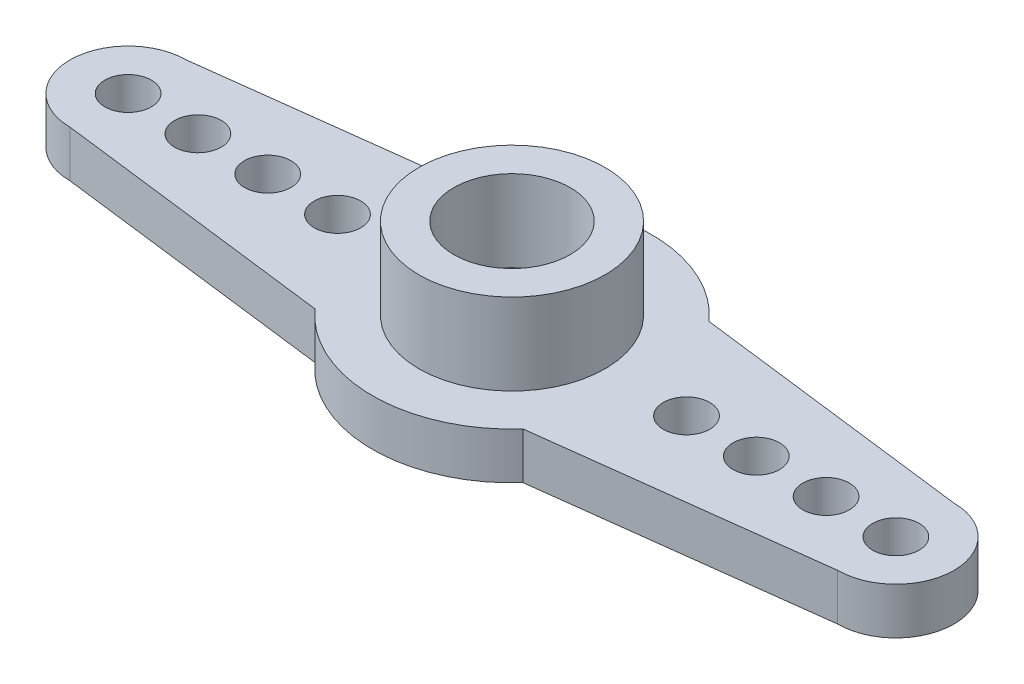
ISO-10303-21;
HEADER;
FILE_DESCRIPTION(('STEP AP214'),'2;1');
FILE_NAME('part.step','',(''),(''),'','','');
FILE_SCHEMA(('AUTOMOTIVE_DESIGN { 1 0 10303 214 1 1 1 1 }'));
ENDSEC;
DATA;
#1=APPLICATION_CONTEXT('core data for automotive mechanical design processes');
#2=APPLICATION_PROTOCOL_DEFINITION('international standard','automotive_design',2000,#1);
#3=PRODUCT_CONTEXT('',#1,'mechanical');
#4=PRODUCT('Part','Part','',(#3));
#5=PRODUCT_RELATED_PRODUCT_CATEGORY('part','',(#4));
#6=PRODUCT_DEFINITION_FORMATION('','',#4);
#7=PRODUCT_DEFINITION_CONTEXT('part definition',#1,'design');
#8=PRODUCT_DEFINITION('design','',#6,#7);
#9=PRODUCT_DEFINITION_SHAPE('','',#8);
#10=(LENGTH_UNIT() NAMED_UNIT(*) SI_UNIT(.MILLI.,.METRE.));
#11=(NAMED_UNIT(*) PLANE_ANGLE_UNIT() SI_UNIT($,.RADIAN.));
#12=(NAMED_UNIT(*) SI_UNIT($,.STERADIAN.) SOLID_ANGLE_UNIT());
#13=UNCERTAINTY_MEASURE_WITH_UNIT(LENGTH_MEASURE(1.E-05),#10,'distance_accuracy_value','');
#14=(GEOMETRIC_REPRESENTATION_CONTEXT(3) GLOBAL_UNCERTAINTY_ASSIGNED_CONTEXT((#13)) GLOBAL_UNIT_ASSIGNED_CONTEXT((#10,
#11,#12)) REPRESENTATION_CONTEXT('',''));
#15=CARTESIAN_POINT('',(0.,0.,0.));
#16=DIRECTION('',(0.,0.,1.));
#17=DIRECTION('',(1.,0.,0.));
#18=AXIS2_PLACEMENT_3D('',#15,#16,#17);
#19=CARTESIAN_POINT('',(16.5,2.,0.));
#20=DIRECTION('',(0.,1.,0.));
#21=DIRECTION('',(0.,0.,1.));
#22=AXIS2_PLACEMENT_3D('',#19,#20,#21);
#23=PLANE('',#22);
#24=CARTESIAN_POINT('',(-16.5,2.,0.));
#25=DIRECTION('',(0.,1.,0.));
#26=DIRECTION('',(0.,0.,1.));
#27=AXIS2_PLACEMENT_3D('',#24,#25,#26);
#28=CIRCLE('',#27,1.);
#29=CARTESIAN_POINT('',(-16.5,2.,0.999999999999996));
#30=VERTEX_POINT('',#29);
#31=EDGE_CURVE('E202',#30,#30,#28,.F.);
#32=ORIENTED_EDGE('',*,*,#31,.T.);
#33=EDGE_LOOP('',(#32));
#34=FACE_BOUND('',#33,.T.);
#35=CARTESIAN_POINT('',(-13.5,2.,0.));
#36=DIRECTION('',(0.,1.,0.));
#37=DIRECTION('',(0.,0.,1.));
#38=AXIS2_PLACEMENT_3D('',#35,#36,#37);
#39=CIRCLE('',#38,1.);
#40=CARTESIAN_POINT('',(-13.5,2.,0.999999999999976));
#41=VERTEX_POINT('',#40);
#42=EDGE_CURVE('E207',#41,#41,#39,.F.);
#43=ORIENTED_EDGE('',*,*,#42,.T.);
#44=EDGE_LOOP('',(#43));
#45=FACE_BOUND('',#44,.T.);
#46=CARTESIAN_POINT('',(-7.5,2.,0.));
#47=DIRECTION('',(0.,1.,0.));
#48=DIRECTION('',(0.,0.,1.));
#49=AXIS2_PLACEMENT_3D('',#46,#47,#48);
#50=CIRCLE('',#49,1.);
#51=CARTESIAN_POINT('',(-7.5,2.,0.999999999999936));
#52=VERTEX_POINT('',#51);
#53=EDGE_CURVE('E222',#52,#52,#50,.F.);
#54=ORIENTED_EDGE('',*,*,#53,.T.);
#55=EDGE_LOOP('',(#54));
#56=FACE_BOUND('',#55,.T.);
#57=CARTESIAN_POINT('',(-10.5,2.,0.));
#58=DIRECTION('',(0.,1.,0.));
#59=DIRECTION('',(0.,0.,1.));
#60=AXIS2_PLACEMENT_3D('',#57,#58,#59);
#61=CIRCLE('',#60,1.);
#62=CARTESIAN_POINT('',(-10.5,2.,0.999999999999956));
#63=VERTEX_POINT('',#62);
#64=EDGE_CURVE('E225',#63,#63,#61,.F.);
#65=ORIENTED_EDGE('',*,*,#64,.T.);
#66=EDGE_LOOP('',(#65));
#67=FACE_BOUND('',#66,.T.);
#68=CARTESIAN_POINT('',(0.,2.,0.));
#69=DIRECTION('',(0.,1.,0.));
#70=DIRECTION('',(0.,0.,1.));
#71=AXIS2_PLACEMENT_3D('',#68,#69,#70);
#72=CIRCLE('',#71,4.);
#73=CARTESIAN_POINT('',(0.,2.,4.));
#74=VERTEX_POINT('',#73);
#75=EDGE_CURVE('E187',#74,#74,#72,.T.);
#76=ORIENTED_EDGE('',*,*,#75,.F.);
#77=EDGE_LOOP('',(#76));
#78=FACE_BOUND('',#77,.T.);
#79=CARTESIAN_POINT('',(16.5,2.,0.));
#80=DIRECTION('',(0.,1.,0.));
#81=DIRECTION('',(0.,0.,1.));
#82=AXIS2_PLACEMENT_3D('',#79,#80,#81);
#83=CIRCLE('',#82,2.5);
#84=CARTESIAN_POINT('',(16.5,2.,2.5));
#85=VERTEX_POINT('',#84);
#86=CARTESIAN_POINT('',(16.5,2.,-2.5));
#87=VERTEX_POINT('',#86);
#88=EDGE_CURVE('E148',#85,#87,#83,.T.);
#89=ORIENTED_EDGE('',*,*,#88,.T.);
#90=DIRECTION('',(-0.992313202794284,0.,-0.123751798209769));
#91=VECTOR('',#90,1.);
#92=CARTESIAN_POINT('',(16.5,2.,-2.5));
#93=LINE('',#92,#91);
#94=CARTESIAN_POINT('',(4.47213595499958,2.,-4.));
#95=VERTEX_POINT('',#94);
#96=EDGE_CURVE('E96',#87,#95,#93,.T.);
#97=ORIENTED_EDGE('',*,*,#96,.T.);
#98=CARTESIAN_POINT('',(0.,2.,0.));
#99=DIRECTION('',(0.,1.,0.));
#100=DIRECTION('',(0.,0.,1.));
#101=AXIS2_PLACEMENT_3D('',#98,#99,#100);
#102=CIRCLE('',#101,6.);
#103=CARTESIAN_POINT('',(-4.47213595499958,2.,-4.));
#104=VERTEX_POINT('',#103);
#105=EDGE_CURVE('E181',#95,#104,#102,.T.);
#106=ORIENTED_EDGE('',*,*,#105,.T.);
#107=DIRECTION('',(-0.992313202794284,0.,0.123751798209769));
#108=VECTOR('',#107,1.);
#109=CARTESIAN_POINT('',(-16.5,2.,-2.5));
#110=LINE('',#109,#108);
#111=CARTESIAN_POINT('',(-16.5,2.,-2.5));
#112=VERTEX_POINT('',#111);
#113=EDGE_CURVE('E180',#104,#112,#110,.T.);
#114=ORIENTED_EDGE('',*,*,#113,.T.);
#115=CARTESIAN_POINT('',(-16.5,2.,0.));
#116=DIRECTION('',(0.,1.,0.));
#117=DIRECTION('',(0.,0.,1.));
#118=AXIS2_PLACEMENT_3D('',#115,#116,#117);
#119=CIRCLE('',#118,2.5);
#120=CARTESIAN_POINT('',(-16.5,2.,2.5));
#121=VERTEX_POINT('',#120);
#122=EDGE_CURVE('E115',#112,#121,#119,.T.);
#123=ORIENTED_EDGE('',*,*,#122,.T.);
#124=DIRECTION('',(0.992313202794284,0.,0.123751798209769));
#125=VECTOR('',#124,1.);
#126=CARTESIAN_POINT('',(-16.5,2.,2.5));
#127=LINE('',#126,#125);
#128=CARTESIAN_POINT('',(-4.47213595499958,2.,4.));
#129=VERTEX_POINT('',#128);
#130=EDGE_CURVE('E109',#121,#129,#127,.T.);
#131=ORIENTED_EDGE('',*,*,#130,.T.);
#132=CARTESIAN_POINT('',(0.,2.,0.));
#133=DIRECTION('',(0.,1.,0.));
#134=DIRECTION('',(0.,0.,1.));
#135=AXIS2_PLACEMENT_3D('',#132,#133,#134);
#136=CIRCLE('',#135,6.);
#137=CARTESIAN_POINT('',(4.47213595499958,2.,4.));
#138=VERTEX_POINT('',#137);
#139=EDGE_CURVE('E113',#129,#138,#136,.T.);
#140=ORIENTED_EDGE('',*,*,#139,.T.);
#141=DIRECTION('',(0.992313202794284,0.,-0.123751798209769));
#142=VECTOR('',#141,1.);
#143=CARTESIAN_POINT('',(16.5,2.,2.5));
#144=LINE('',#143,#142);
#145=EDGE_CURVE('E52',#138,#85,#144,.T.);
#146=ORIENTED_EDGE('',*,*,#145,.T.);
#147=EDGE_LOOP('',(#89,#97,#106,#114,#123,#131,#140,#146));
#148=FACE_BOUND('',#147,.T.);
#149=CARTESIAN_POINT('',(7.5,2.,0.));
#150=DIRECTION('',(0.,1.,0.));
#151=DIRECTION('',(0.,0.,1.));
#152=AXIS2_PLACEMENT_3D('',#149,#150,#151);
#153=CIRCLE('',#152,1.);
#154=CARTESIAN_POINT('',(7.5,2.,0.999999999999939));
#155=VERTEX_POINT('',#154);
#156=EDGE_CURVE('E219',#155,#155,#153,.T.);
#157=ORIENTED_EDGE('',*,*,#156,.F.);
#158=EDGE_LOOP('',(#157));
#159=FACE_BOUND('',#158,.T.);
#160=CARTESIAN_POINT('',(10.5,2.,0.));
#161=DIRECTION('',(0.,1.,0.));
#162=DIRECTION('',(0.,0.,1.));
#163=AXIS2_PLACEMENT_3D('',#160,#161,#162);
#164=CIRCLE('',#163,1.);
#165=CARTESIAN_POINT('',(10.5,2.,0.99999999999996));
#166=VERTEX_POINT('',#165);
#167=EDGE_CURVE('E216',#166,#166,#164,.T.);
#168=ORIENTED_EDGE('',*,*,#167,.F.);
#169=EDGE_LOOP('',(#168));
#170=FACE_BOUND('',#169,.T.);
#171=CARTESIAN_POINT('',(13.5,2.,0.));
#172=DIRECTION('',(0.,1.,0.));
#173=DIRECTION('',(0.,0.,1.));
#174=AXIS2_PLACEMENT_3D('',#171,#172,#173);
#175=CIRCLE('',#174,1.);
#176=CARTESIAN_POINT('',(13.5,2.,0.99999999999998));
#177=VERTEX_POINT('',#176);
#178=EDGE_CURVE('E213',#177,#177,#175,.T.);
#179=ORIENTED_EDGE('',*,*,#178,.F.);
#180=EDGE_LOOP('',(#179));
#181=FACE_BOUND('',#180,.T.);
#182=CARTESIAN_POINT('',(16.5,2.,0.));
#183=DIRECTION('',(0.,1.,0.));
#184=DIRECTION('',(0.,0.,1.));
#185=AXIS2_PLACEMENT_3D('',#182,#183,#184);
#186=CIRCLE('',#185,1.);
#187=CARTESIAN_POINT('',(16.5,2.,1.));
#188=VERTEX_POINT('',#187);
#189=EDGE_CURVE('E210',#188,#188,#186,.T.);
#190=ORIENTED_EDGE('',*,*,#189,.F.);
#191=EDGE_LOOP('',(#190));
#192=FACE_BOUND('',#191,.T.);
#193=ADVANCED_FACE('F34',(#34,#45,#56,#67,#78,#148,#159,#170,#181,#192),#23,.T.);
#194=CARTESIAN_POINT('',(16.5,0.,0.));
#195=DIRECTION('',(0.,1.,0.));
#196=DIRECTION('',(0.,0.,1.));
#197=AXIS2_PLACEMENT_3D('',#194,#195,#196);
#198=PLANE('',#197);
#199=CARTESIAN_POINT('',(-16.5,0.,0.));
#200=DIRECTION('',(0.,-1.,0.));
#201=DIRECTION('',(0.,0.,-1.));
#202=AXIS2_PLACEMENT_3D('',#199,#200,#201);
#203=CIRCLE('',#202,1.);
#204=CARTESIAN_POINT('',(-16.5,0.,-1.00000000000001));
#205=VERTEX_POINT('',#204);
#206=EDGE_CURVE('E228',#205,#205,#203,.F.);
#207=ORIENTED_EDGE('',*,*,#206,.T.);
#208=EDGE_LOOP('',(#207));
#209=FACE_BOUND('',#208,.T.);
#210=CARTESIAN_POINT('',(-13.5,0.,0.));
#211=DIRECTION('',(0.,1.,0.));
#212=DIRECTION('',(0.,0.,1.));
#213=AXIS2_PLACEMENT_3D('',#210,#211,#212);
#214=CIRCLE('',#213,1.);
#215=CARTESIAN_POINT('',(-13.5,0.,0.999999999999976));
#216=VERTEX_POINT('',#215);
#217=EDGE_CURVE('E242',#216,#216,#214,.T.);
#218=ORIENTED_EDGE('',*,*,#217,.T.);
#219=EDGE_LOOP('',(#218));
#220=FACE_BOUND('',#219,.T.);
#221=CARTESIAN_POINT('',(13.5,0.,0.));
#222=DIRECTION('',(0.,-1.,0.));
#223=DIRECTION('',(0.,0.,-1.));
#224=AXIS2_PLACEMENT_3D('',#221,#222,#223);
#225=CIRCLE('',#224,1.);
#226=CARTESIAN_POINT('',(13.5,0.,-1.00000000000002));
#227=VERTEX_POINT('',#226);
#228=EDGE_CURVE('E233',#227,#227,#225,.T.);
#229=ORIENTED_EDGE('',*,*,#228,.F.);
#230=EDGE_LOOP('',(#229));
#231=FACE_BOUND('',#230,.T.);
#232=CARTESIAN_POINT('',(7.5,0.,0.));
#233=DIRECTION('',(0.,-1.,0.));
#234=DIRECTION('',(0.,0.,-1.));
#235=AXIS2_PLACEMENT_3D('',#232,#233,#234);
#236=CIRCLE('',#235,1.);
#237=CARTESIAN_POINT('',(7.5,0.,-1.00000000000006));
#238=VERTEX_POINT('',#237);
#239=EDGE_CURVE('E232',#238,#238,#236,.T.);
#240=ORIENTED_EDGE('',*,*,#239,.F.);
#241=EDGE_LOOP('',(#240));
#242=FACE_BOUND('',#241,.T.);
#243=CARTESIAN_POINT('',(-7.5,0.,0.));
#244=DIRECTION('',(0.,-1.,0.));
#245=DIRECTION('',(0.,0.,-1.));
#246=AXIS2_PLACEMENT_3D('',#243,#244,#245);
#247=CIRCLE('',#246,1.);
#248=CARTESIAN_POINT('',(-7.5,0.,-1.00000000000007));
#249=VERTEX_POINT('',#248);
#250=EDGE_CURVE('E236',#249,#249,#247,.F.);
#251=ORIENTED_EDGE('',*,*,#250,.T.);
#252=EDGE_LOOP('',(#251));
#253=FACE_BOUND('',#252,.T.);
#254=CARTESIAN_POINT('',(-10.5,0.,0.));
#255=DIRECTION('',(0.,-1.,0.));
#256=DIRECTION('',(0.,0.,-1.));
#257=AXIS2_PLACEMENT_3D('',#254,#255,#256);
#258=CIRCLE('',#257,1.);
#259=CARTESIAN_POINT('',(-10.5,0.,-1.00000000000005));
#260=VERTEX_POINT('',#259);
#261=EDGE_CURVE('E239',#260,#260,#258,.F.);
#262=ORIENTED_EDGE('',*,*,#261,.T.);
#263=EDGE_LOOP('',(#262));
#264=FACE_BOUND('',#263,.T.);
#265=CARTESIAN_POINT('',(0.,0.,0.));
#266=DIRECTION('',(0.,-1.,0.));
#267=DIRECTION('',(0.,0.,-1.));
#268=AXIS2_PLACEMENT_3D('',#265,#266,#267);
#269=CIRCLE('',#268,3.);
#270=CARTESIAN_POINT('',(0.,0.,-3.));
#271=VERTEX_POINT('',#270);
#272=EDGE_CURVE('E198',#271,#271,#269,.T.);
#273=ORIENTED_EDGE('',*,*,#272,.F.);
#274=EDGE_LOOP('',(#273));
#275=FACE_BOUND('',#274,.T.);
#276=CARTESIAN_POINT('',(16.5,0.,0.));
#277=DIRECTION('',(0.,1.,0.));
#278=DIRECTION('',(0.,0.,1.));
#279=AXIS2_PLACEMENT_3D('',#276,#277,#278);
#280=CIRCLE('',#279,2.5);
#281=CARTESIAN_POINT('',(16.5,0.,2.5));
#282=VERTEX_POINT('',#281);
#283=CARTESIAN_POINT('',(16.5,0.,-2.5));
#284=VERTEX_POINT('',#283);
#285=EDGE_CURVE('E133',#282,#284,#280,.T.);
#286=ORIENTED_EDGE('',*,*,#285,.F.);
#287=DIRECTION('',(0.992313202794284,0.,-0.123751798209769));
#288=VECTOR('',#287,1.);
#289=CARTESIAN_POINT('',(16.5,0.,2.5));
#290=LINE('',#289,#288);
#291=CARTESIAN_POINT('',(4.47213595499958,0.,4.));
#292=VERTEX_POINT('',#291);
#293=EDGE_CURVE('E87',#292,#282,#290,.T.);
#294=ORIENTED_EDGE('',*,*,#293,.F.);
#295=CARTESIAN_POINT('',(0.,0.,0.));
#296=DIRECTION('',(0.,1.,0.));
#297=DIRECTION('',(0.,0.,1.));
#298=AXIS2_PLACEMENT_3D('',#295,#296,#297);
#299=CIRCLE('',#298,6.);
#300=CARTESIAN_POINT('',(-4.47213595499958,0.,4.));
#301=VERTEX_POINT('',#300);
#302=EDGE_CURVE('E81',#301,#292,#299,.T.);
#303=ORIENTED_EDGE('',*,*,#302,.F.);
#304=DIRECTION('',(0.992313202794284,0.,0.123751798209769));
#305=VECTOR('',#304,1.);
#306=CARTESIAN_POINT('',(-16.5,0.,2.5));
#307=LINE('',#306,#305);
#308=CARTESIAN_POINT('',(-16.5,0.,2.5));
#309=VERTEX_POINT('',#308);
#310=EDGE_CURVE('E123',#309,#301,#307,.T.);
#311=ORIENTED_EDGE('',*,*,#310,.F.);
#312=CARTESIAN_POINT('',(-16.5,0.,0.));
#313=DIRECTION('',(0.,1.,0.));
#314=DIRECTION('',(0.,0.,1.));
#315=AXIS2_PLACEMENT_3D('',#312,#313,#314);
#316=CIRCLE('',#315,2.5);
#317=CARTESIAN_POINT('',(-16.5,0.,-2.5));
#318=VERTEX_POINT('',#317);
#319=EDGE_CURVE('E143',#318,#309,#316,.T.);
#320=ORIENTED_EDGE('',*,*,#319,.F.);
#321=DIRECTION('',(-0.992313202794284,0.,0.123751798209769));
#322=VECTOR('',#321,1.);
#323=CARTESIAN_POINT('',(-16.5,0.,-2.5));
#324=LINE('',#323,#322);
#325=CARTESIAN_POINT('',(-4.47213595499958,0.,-4.));
#326=VERTEX_POINT('',#325);
#327=EDGE_CURVE('E141',#326,#318,#324,.T.);
#328=ORIENTED_EDGE('',*,*,#327,.F.);
#329=CARTESIAN_POINT('',(0.,0.,0.));
#330=DIRECTION('',(0.,1.,0.));
#331=DIRECTION('',(0.,0.,1.));
#332=AXIS2_PLACEMENT_3D('',#329,#330,#331);
#333=CIRCLE('',#332,6.);
#334=CARTESIAN_POINT('',(4.47213595499958,0.,-4.));
#335=VERTEX_POINT('',#334);
#336=EDGE_CURVE('E139',#335,#326,#333,.T.);
#337=ORIENTED_EDGE('',*,*,#336,.F.);
#338=DIRECTION('',(-0.992313202794284,0.,-0.123751798209769));
#339=VECTOR('',#338,1.);
#340=CARTESIAN_POINT('',(16.5,0.,-2.5));
#341=LINE('',#340,#339);
#342=EDGE_CURVE('E136',#284,#335,#341,.T.);
#343=ORIENTED_EDGE('',*,*,#342,.F.);
#344=EDGE_LOOP('',(#286,#294,#303,#311,#320,#328,#337,#343));
#345=FACE_BOUND('',#344,.T.);
#346=CARTESIAN_POINT('',(10.5,0.,0.));
#347=DIRECTION('',(0.,-1.,0.));
#348=DIRECTION('',(0.,0.,-1.));
#349=AXIS2_PLACEMENT_3D('',#346,#347,#348);
#350=CIRCLE('',#349,1.);
#351=CARTESIAN_POINT('',(10.5,0.,-1.00000000000004));
#352=VERTEX_POINT('',#351);
#353=EDGE_CURVE('E229',#352,#352,#350,.T.);
#354=ORIENTED_EDGE('',*,*,#353,.F.);
#355=EDGE_LOOP('',(#354));
#356=FACE_BOUND('',#355,.T.);
#357=CARTESIAN_POINT('',(16.5,0.,0.));
#358=DIRECTION('',(0.,-1.,0.));
#359=DIRECTION('',(0.,0.,-1.));
#360=AXIS2_PLACEMENT_3D('',#357,#358,#359);
#361=CIRCLE('',#360,1.);
#362=CARTESIAN_POINT('',(16.5,0.,-1.));
#363=VERTEX_POINT('',#362);
#364=EDGE_CURVE('E245',#363,#363,#361,.T.);
#365=ORIENTED_EDGE('',*,*,#364,.F.);
#366=EDGE_LOOP('',(#365));
#367=FACE_BOUND('',#366,.T.);
#368=ADVANCED_FACE('F167',(#209,#220,#231,#242,#253,#264,#275,#345,#356,#367),#198,.F.);
#369=CARTESIAN_POINT('',(0.,-3.,0.));
#370=DIRECTION('',(0.,1.,0.));
#371=DIRECTION('',(0.,0.,1.));
#372=AXIS2_PLACEMENT_3D('',#369,#370,#371);
#373=CYLINDRICAL_SURFACE('',#372,1.5);
#374=CARTESIAN_POINT('',(0.,2.,0.));
#375=DIRECTION('',(0.,1.,0.));
#376=DIRECTION('',(0.,0.,1.));
#377=AXIS2_PLACEMENT_3D('',#374,#375,#376);
#378=CIRCLE('',#377,1.5);
#379=CARTESIAN_POINT('',(0.,2.,1.5));
#380=VERTEX_POINT('',#379);
#381=EDGE_CURVE('E195',#380,#380,#378,.T.);
#382=ORIENTED_EDGE('',*,*,#381,.T.);
#383=EDGE_LOOP('',(#382));
#384=FACE_BOUND('',#383,.T.);
#385=CARTESIAN_POINT('',(0.,1.,0.));
#386=DIRECTION('',(0.,-1.,0.));
#387=DIRECTION('',(0.,0.,-1.));
#388=AXIS2_PLACEMENT_3D('',#385,#386,#387);
#389=CIRCLE('',#388,1.5);
#390=CARTESIAN_POINT('',(0.,1.,-1.5));
#391=VERTEX_POINT('',#390);
#392=EDGE_CURVE('E38',#391,#391,#389,.F.);
#393=ORIENTED_EDGE('',*,*,#392,.F.);
#394=EDGE_LOOP('',(#393));
#395=FACE_BOUND('',#394,.T.);
#396=ADVANCED_FACE('F275',(#384,#395),#373,.F.);
#397=CARTESIAN_POINT('',(16.5,2.,0.));
#398=DIRECTION('',(0.,-1.,0.));
#399=DIRECTION('',(0.,0.,-1.));
#400=AXIS2_PLACEMENT_3D('',#397,#398,#399);
#401=CYLINDRICAL_SURFACE('',#400,2.5);
#402=ORIENTED_EDGE('',*,*,#285,.T.);
#403=DIRECTION('',(0.,-1.,0.));
#404=VECTOR('',#403,1.);
#405=CARTESIAN_POINT('',(16.5,2.,-2.5));
#406=LINE('',#405,#404);
#407=EDGE_CURVE('E44',#87,#284,#406,.T.);
#408=ORIENTED_EDGE('',*,*,#407,.F.);
#409=ORIENTED_EDGE('',*,*,#88,.F.);
#410=DIRECTION('',(0.,-1.,0.));
#411=VECTOR('',#410,1.);
#412=CARTESIAN_POINT('',(16.5,2.,2.5));
#413=LINE('',#412,#411);
#414=EDGE_CURVE('E129',#85,#282,#413,.T.);
#415=ORIENTED_EDGE('',*,*,#414,.T.);
#416=EDGE_LOOP('',(#402,#408,#409,#415));
#417=FACE_BOUND('',#416,.T.);
#418=ADVANCED_FACE('F36',(#417),#401,.T.);
#419=CARTESIAN_POINT('',(16.5,2.,-2.5));
#420=DIRECTION('',(-0.123751798209769,0.,0.992313202794283));
#421=DIRECTION('',(0.992313202794283,0.,0.123751798209769));
#422=AXIS2_PLACEMENT_3D('',#419,#420,#421);
#423=PLANE('',#422);
#424=ORIENTED_EDGE('',*,*,#342,.T.);
#425=DIRECTION('',(0.,-1.,0.));
#426=VECTOR('',#425,1.);
#427=CARTESIAN_POINT('',(4.47213595499958,2.,-4.));
#428=LINE('',#427,#426);
#429=EDGE_CURVE('E158',#95,#335,#428,.T.);
#430=ORIENTED_EDGE('',*,*,#429,.F.);
#431=ORIENTED_EDGE('',*,*,#96,.F.);
#432=ORIENTED_EDGE('',*,*,#407,.T.);
#433=EDGE_LOOP('',(#424,#430,#431,#432));
#434=FACE_BOUND('',#433,.T.);
#435=ADVANCED_FACE('F162',(#434),#423,.F.);
#436=CARTESIAN_POINT('',(0.,2.,0.));
#437=DIRECTION('',(0.,-1.,0.));
#438=DIRECTION('',(0.,0.,-1.));
#439=AXIS2_PLACEMENT_3D('',#436,#437,#438);
#440=CYLINDRICAL_SURFACE('',#439,6.);
#441=ORIENTED_EDGE('',*,*,#336,.T.);
#442=DIRECTION('',(0.,-1.,0.));
#443=VECTOR('',#442,1.);
#444=CARTESIAN_POINT('',(-4.47213595499958,2.,-4.));
#445=LINE('',#444,#443);
#446=EDGE_CURVE('E155',#104,#326,#445,.T.);
#447=ORIENTED_EDGE('',*,*,#446,.F.);
#448=ORIENTED_EDGE('',*,*,#105,.F.);
#449=ORIENTED_EDGE('',*,*,#429,.T.);
#450=EDGE_LOOP('',(#441,#447,#448,#449));
#451=FACE_BOUND('',#450,.T.);
#452=ADVANCED_FACE('F174',(#451),#440,.T.);
#453=CARTESIAN_POINT('',(-16.5,2.,-2.5));
#454=DIRECTION('',(0.123751798209769,0.,0.992313202794283));
#455=DIRECTION('',(0.992313202794283,0.,-0.123751798209769));
#456=AXIS2_PLACEMENT_3D('',#453,#454,#455);
#457=PLANE('',#456);
#458=ORIENTED_EDGE('',*,*,#327,.T.);
#459=DIRECTION('',(0.,-1.,0.));
#460=VECTOR('',#459,1.);
#461=CARTESIAN_POINT('',(-16.5,2.,-2.5));
#462=LINE('',#461,#460);
#463=EDGE_CURVE('E152',#112,#318,#462,.T.);
#464=ORIENTED_EDGE('',*,*,#463,.F.);
#465=ORIENTED_EDGE('',*,*,#113,.F.);
#466=ORIENTED_EDGE('',*,*,#446,.T.);
#467=EDGE_LOOP('',(#458,#464,#465,#466));
#468=FACE_BOUND('',#467,.T.);
#469=ADVANCED_FACE('F178',(#468),#457,.F.);
#470=CARTESIAN_POINT('',(-16.5,2.,0.));
#471=DIRECTION('',(0.,-1.,0.));
#472=DIRECTION('',(0.,0.,-1.));
#473=AXIS2_PLACEMENT_3D('',#470,#471,#472);
#474=CYLINDRICAL_SURFACE('',#473,2.5);
#475=ORIENTED_EDGE('',*,*,#319,.T.);
#476=DIRECTION('',(0.,-1.,0.));
#477=VECTOR('',#476,1.);
#478=CARTESIAN_POINT('',(-16.5,2.,2.5));
#479=LINE('',#478,#477);
#480=EDGE_CURVE('E124',#121,#309,#479,.T.);
#481=ORIENTED_EDGE('',*,*,#480,.F.);
#482=ORIENTED_EDGE('',*,*,#122,.F.);
#483=ORIENTED_EDGE('',*,*,#463,.T.);
#484=EDGE_LOOP('',(#475,#481,#482,#483));
#485=FACE_BOUND('',#484,.T.);
#486=ADVANCED_FACE('F492',(#485),#474,.T.);
#487=CARTESIAN_POINT('',(-16.5,2.,2.5));
#488=DIRECTION('',(0.123751798209769,0.,-0.992313202794283));
#489=DIRECTION('',(-0.992313202794283,0.,-0.123751798209769));
#490=AXIS2_PLACEMENT_3D('',#487,#488,#489);
#491=PLANE('',#490);
#492=ORIENTED_EDGE('',*,*,#310,.T.);
#493=DIRECTION('',(0.,-1.,0.));
#494=VECTOR('',#493,1.);
#495=CARTESIAN_POINT('',(-4.47213595499958,2.,4.));
#496=LINE('',#495,#494);
#497=EDGE_CURVE('E120',#129,#301,#496,.T.);
#498=ORIENTED_EDGE('',*,*,#497,.F.);
#499=ORIENTED_EDGE('',*,*,#130,.F.);
#500=ORIENTED_EDGE('',*,*,#480,.T.);
#501=EDGE_LOOP('',(#492,#498,#499,#500));
#502=FACE_BOUND('',#501,.T.);
#503=ADVANCED_FACE('F121',(#502),#491,.F.);
#504=CARTESIAN_POINT('',(0.,2.,0.));
#505=DIRECTION('',(0.,-1.,0.));
#506=DIRECTION('',(0.,0.,-1.));
#507=AXIS2_PLACEMENT_3D('',#504,#505,#506);
#508=CYLINDRICAL_SURFACE('',#507,6.);
#509=ORIENTED_EDGE('',*,*,#302,.T.);
#510=DIRECTION('',(0.,-1.,0.));
#511=VECTOR('',#510,1.);
#512=CARTESIAN_POINT('',(4.47213595499958,2.,4.));
#513=LINE('',#512,#511);
#514=EDGE_CURVE('E125',#138,#292,#513,.T.);
#515=ORIENTED_EDGE('',*,*,#514,.F.);
#516=ORIENTED_EDGE('',*,*,#139,.F.);
#517=ORIENTED_EDGE('',*,*,#497,.T.);
#518=EDGE_LOOP('',(#509,#515,#516,#517));
#519=FACE_BOUND('',#518,.T.);
#520=ADVANCED_FACE('F127',(#519),#508,.T.);
#521=CARTESIAN_POINT('',(16.5,2.,2.5));
#522=DIRECTION('',(-0.123751798209769,0.,-0.992313202794283));
#523=DIRECTION('',(-0.992313202794283,0.,0.123751798209769));
#524=AXIS2_PLACEMENT_3D('',#521,#522,#523);
#525=PLANE('',#524);
#526=ORIENTED_EDGE('',*,*,#293,.T.);
#527=ORIENTED_EDGE('',*,*,#414,.F.);
#528=ORIENTED_EDGE('',*,*,#145,.F.);
#529=ORIENTED_EDGE('',*,*,#514,.T.);
#530=EDGE_LOOP('',(#526,#527,#528,#529));
#531=FACE_BOUND('',#530,.T.);
#532=ADVANCED_FACE('F311',(#531),#525,.F.);
#533=CARTESIAN_POINT('',(0.,5.5,0.));
#534=DIRECTION('',(0.,1.,0.));
#535=DIRECTION('',(0.,0.,1.));
#536=AXIS2_PLACEMENT_3D('',#533,#534,#535);
#537=PLANE('',#536);
#538=CARTESIAN_POINT('',(0.,5.5,0.));
#539=DIRECTION('',(0.,1.,0.));
#540=DIRECTION('',(0.,0.,1.));
#541=AXIS2_PLACEMENT_3D('',#538,#539,#540);
#542=CIRCLE('',#541,4.);
#543=CARTESIAN_POINT('',(0.,5.5,4.));
#544=VERTEX_POINT('',#543);
#545=EDGE_CURVE('E137',#544,#544,#542,.T.);
#546=ORIENTED_EDGE('',*,*,#545,.T.);
#547=EDGE_LOOP('',(#546));
#548=FACE_BOUND('',#547,.T.);
#549=CARTESIAN_POINT('',(0.,5.5,0.));
#550=DIRECTION('',(0.,1.,0.));
#551=DIRECTION('',(0.,0.,1.));
#552=AXIS2_PLACEMENT_3D('',#549,#550,#551);
#553=CIRCLE('',#552,2.5);
#554=CARTESIAN_POINT('',(0.,5.5,2.5));
#555=VERTEX_POINT('',#554);
#556=EDGE_CURVE('E190',#555,#555,#553,.T.);
#557=ORIENTED_EDGE('',*,*,#556,.F.);
#558=EDGE_LOOP('',(#557));
#559=FACE_BOUND('',#558,.T.);
#560=ADVANCED_FACE('F309',(#548,#559),#537,.T.);
#561=CARTESIAN_POINT('',(0.,5.5,0.));
#562=DIRECTION('',(0.,-1.,0.));
#563=DIRECTION('',(0.,0.,-1.));
#564=AXIS2_PLACEMENT_3D('',#561,#562,#563);
#565=CYLINDRICAL_SURFACE('',#564,4.);
#566=ORIENTED_EDGE('',*,*,#545,.F.);
#567=EDGE_LOOP('',(#566));
#568=FACE_BOUND('',#567,.T.);
#569=ORIENTED_EDGE('',*,*,#75,.T.);
#570=EDGE_LOOP('',(#569));
#571=FACE_BOUND('',#570,.T.);
#572=ADVANCED_FACE('F290',(#568,#571),#565,.T.);
#573=CARTESIAN_POINT('',(0.,5.5,0.));
#574=DIRECTION('',(0.,-1.,0.));
#575=DIRECTION('',(0.,0.,-1.));
#576=AXIS2_PLACEMENT_3D('',#573,#574,#575);
#577=CYLINDRICAL_SURFACE('',#576,2.5);
#578=ORIENTED_EDGE('',*,*,#556,.T.);
#579=EDGE_LOOP('',(#578));
#580=FACE_BOUND('',#579,.T.);
#581=CARTESIAN_POINT('',(0.,2.,0.));
#582=DIRECTION('',(0.,1.,0.));
#583=DIRECTION('',(0.,0.,1.));
#584=AXIS2_PLACEMENT_3D('',#581,#582,#583);
#585=CIRCLE('',#584,2.5);
#586=CARTESIAN_POINT('',(0.,2.,2.5));
#587=VERTEX_POINT('',#586);
#588=EDGE_CURVE('E11',#587,#587,#585,.F.);
#589=ORIENTED_EDGE('',*,*,#588,.T.);
#590=EDGE_LOOP('',(#589));
#591=FACE_BOUND('',#590,.T.);
#592=ADVANCED_FACE('F281',(#580,#591),#577,.F.);
#593=ORIENTED_EDGE('',*,*,#381,.F.);
#594=EDGE_LOOP('',(#593));
#595=FACE_BOUND('',#594,.T.);
#596=ORIENTED_EDGE('',*,*,#588,.F.);
#597=EDGE_LOOP('',(#596));
#598=FACE_BOUND('',#597,.T.);
#599=ADVANCED_FACE('F271',(#595,#598),#23,.T.);
#600=CARTESIAN_POINT('',(0.,1.,0.));
#601=DIRECTION('',(0.,-1.,0.));
#602=DIRECTION('',(0.,0.,-1.));
#603=AXIS2_PLACEMENT_3D('',#600,#601,#602);
#604=PLANE('',#603);
#605=CARTESIAN_POINT('',(0.,1.,0.));
#606=DIRECTION('',(0.,-1.,0.));
#607=DIRECTION('',(0.,0.,-1.));
#608=AXIS2_PLACEMENT_3D('',#605,#606,#607);
#609=CIRCLE('',#608,3.);
#610=CARTESIAN_POINT('',(0.,1.,-3.));
#611=VERTEX_POINT('',#610);
#612=EDGE_CURVE('E201',#611,#611,#609,.T.);
#613=ORIENTED_EDGE('',*,*,#612,.T.);
#614=EDGE_LOOP('',(#613));
#615=FACE_BOUND('',#614,.T.);
#616=ORIENTED_EDGE('',*,*,#392,.T.);
#617=EDGE_LOOP('',(#616));
#618=FACE_BOUND('',#617,.T.);
#619=ADVANCED_FACE('F280',(#615,#618),#604,.T.);
#620=CARTESIAN_POINT('',(0.,1.,0.));
#621=DIRECTION('',(0.,-1.,0.));
#622=DIRECTION('',(0.,0.,-1.));
#623=AXIS2_PLACEMENT_3D('',#620,#621,#622);
#624=CYLINDRICAL_SURFACE('',#623,3.);
#625=ORIENTED_EDGE('',*,*,#612,.F.);
#626=EDGE_LOOP('',(#625));
#627=FACE_BOUND('',#626,.T.);
#628=ORIENTED_EDGE('',*,*,#272,.T.);
#629=EDGE_LOOP('',(#628));
#630=FACE_BOUND('',#629,.T.);
#631=ADVANCED_FACE('F287',(#627,#630),#624,.F.);
#632=CARTESIAN_POINT('',(-10.5,5.,0.));
#633=DIRECTION('',(0.,-1.,0.));
#634=DIRECTION('',(0.,0.,-1.));
#635=AXIS2_PLACEMENT_3D('',#632,#633,#634);
#636=CYLINDRICAL_SURFACE('',#635,1.);
#637=ORIENTED_EDGE('',*,*,#64,.F.);
#638=EDGE_LOOP('',(#637));
#639=FACE_BOUND('',#638,.T.);
#640=ORIENTED_EDGE('',*,*,#261,.F.);
#641=EDGE_LOOP('',(#640));
#642=FACE_BOUND('',#641,.T.);
#643=ADVANCED_FACE('F354',(#639,#642),#636,.F.);
#644=CARTESIAN_POINT('',(-7.5,5.,0.));
#645=DIRECTION('',(0.,-1.,0.));
#646=DIRECTION('',(0.,0.,-1.));
#647=AXIS2_PLACEMENT_3D('',#644,#645,#646);
#648=CYLINDRICAL_SURFACE('',#647,1.);
#649=ORIENTED_EDGE('',*,*,#53,.F.);
#650=EDGE_LOOP('',(#649));
#651=FACE_BOUND('',#650,.T.);
#652=ORIENTED_EDGE('',*,*,#250,.F.);
#653=EDGE_LOOP('',(#652));
#654=FACE_BOUND('',#653,.T.);
#655=ADVANCED_FACE('F374',(#651,#654),#648,.F.);
#656=CARTESIAN_POINT('',(7.5,5.,0.));
#657=DIRECTION('',(0.,-1.,0.));
#658=DIRECTION('',(0.,0.,-1.));
#659=AXIS2_PLACEMENT_3D('',#656,#657,#658);
#660=CYLINDRICAL_SURFACE('',#659,1.);
#661=ORIENTED_EDGE('',*,*,#156,.T.);
#662=EDGE_LOOP('',(#661));
#663=FACE_BOUND('',#662,.T.);
#664=ORIENTED_EDGE('',*,*,#239,.T.);
#665=EDGE_LOOP('',(#664));
#666=FACE_BOUND('',#665,.T.);
#667=ADVANCED_FACE('F384',(#663,#666),#660,.F.);
#668=CARTESIAN_POINT('',(10.5,5.,0.));
#669=DIRECTION('',(0.,-1.,0.));
#670=DIRECTION('',(0.,0.,-1.));
#671=AXIS2_PLACEMENT_3D('',#668,#669,#670);
#672=CYLINDRICAL_SURFACE('',#671,1.);
#673=ORIENTED_EDGE('',*,*,#167,.T.);
#674=EDGE_LOOP('',(#673));
#675=FACE_BOUND('',#674,.T.);
#676=ORIENTED_EDGE('',*,*,#353,.T.);
#677=EDGE_LOOP('',(#676));
#678=FACE_BOUND('',#677,.T.);
#679=ADVANCED_FACE('F394',(#675,#678),#672,.F.);
#680=CARTESIAN_POINT('',(13.5,5.,0.));
#681=DIRECTION('',(0.,-1.,0.));
#682=DIRECTION('',(0.,0.,-1.));
#683=AXIS2_PLACEMENT_3D('',#680,#681,#682);
#684=CYLINDRICAL_SURFACE('',#683,1.);
#685=ORIENTED_EDGE('',*,*,#178,.T.);
#686=EDGE_LOOP('',(#685));
#687=FACE_BOUND('',#686,.T.);
#688=ORIENTED_EDGE('',*,*,#228,.T.);
#689=EDGE_LOOP('',(#688));
#690=FACE_BOUND('',#689,.T.);
#691=ADVANCED_FACE('F404',(#687,#690),#684,.F.);
#692=CARTESIAN_POINT('',(16.5,5.,0.));
#693=DIRECTION('',(0.,-1.,0.));
#694=DIRECTION('',(0.,0.,-1.));
#695=AXIS2_PLACEMENT_3D('',#692,#693,#694);
#696=CYLINDRICAL_SURFACE('',#695,1.);
#697=ORIENTED_EDGE('',*,*,#189,.T.);
#698=EDGE_LOOP('',(#697));
#699=FACE_BOUND('',#698,.T.);
#700=ORIENTED_EDGE('',*,*,#364,.T.);
#701=EDGE_LOOP('',(#700));
#702=FACE_BOUND('',#701,.T.);
#703=ADVANCED_FACE('F263',(#699,#702),#696,.F.);
#704=CARTESIAN_POINT('',(-13.5,5.,0.));
#705=DIRECTION('',(0.,-1.,0.));
#706=DIRECTION('',(0.,0.,-1.));
#707=AXIS2_PLACEMENT_3D('',#704,#705,#706);
#708=CYLINDRICAL_SURFACE('',#707,1.);
#709=ORIENTED_EDGE('',*,*,#42,.F.);
#710=EDGE_LOOP('',(#709));
#711=FACE_BOUND('',#710,.T.);
#712=ORIENTED_EDGE('',*,*,#217,.F.);
#713=EDGE_LOOP('',(#712));
#714=FACE_BOUND('',#713,.T.);
#715=ADVANCED_FACE('F257',(#711,#714),#708,.F.);
#716=CARTESIAN_POINT('',(-16.5,5.,0.));
#717=DIRECTION('',(0.,-1.,0.));
#718=DIRECTION('',(0.,0.,-1.));
#719=AXIS2_PLACEMENT_3D('',#716,#717,#718);
#720=CYLINDRICAL_SURFACE('',#719,1.);
#721=ORIENTED_EDGE('',*,*,#31,.F.);
#722=EDGE_LOOP('',(#721));
#723=FACE_BOUND('',#722,.T.);
#724=ORIENTED_EDGE('',*,*,#206,.F.);
#725=EDGE_LOOP('',(#724));
#726=FACE_BOUND('',#725,.T.);
#727=ADVANCED_FACE('F255',(#723,#726),#720,.F.);
#728=CLOSED_SHELL('',(#193,#368,#396,#418,#435,#452,#469,#486,#503,#520,#532,#560,#572,#592,
#599,#619,#631,#643,#655,#667,#679,#691,#703,#715,#727));
#729=MANIFOLD_SOLID_BREP('B2',#728);
#730=ADVANCED_BREP_SHAPE_REPRESENTATION('',(#18,#729),#14);
#731=SHAPE_DEFINITION_REPRESENTATION(#9,#730);
ENDSEC;
END-ISO-10303-21;
